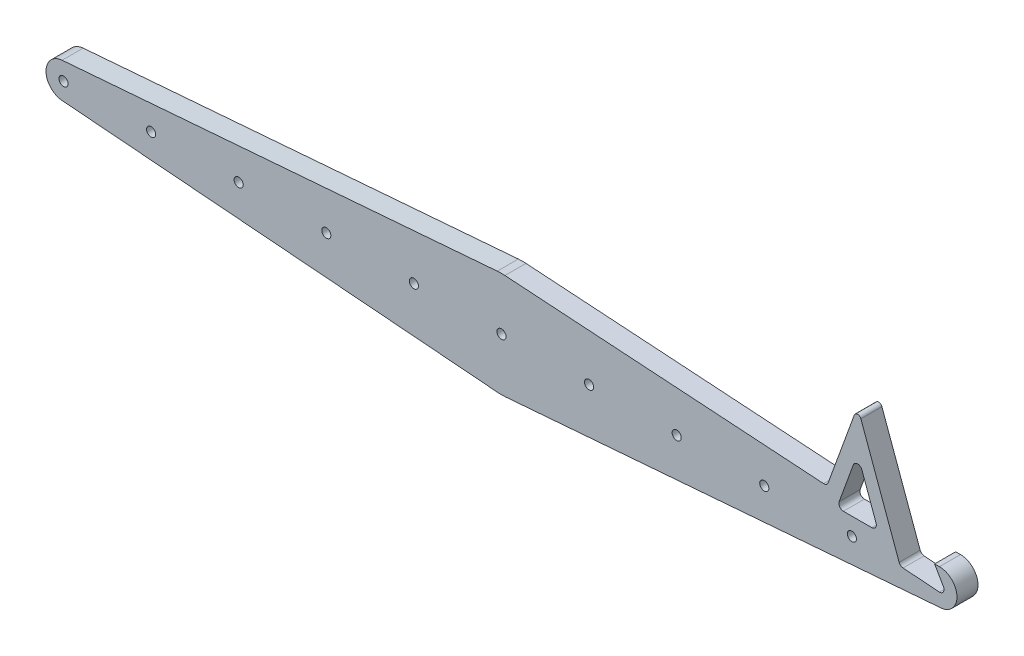
ISO-10303-21;
HEADER;
FILE_DESCRIPTION(('STEP AP214'),'2;1');
FILE_NAME('part.step','',(''),(''),'','','');
FILE_SCHEMA(('AUTOMOTIVE_DESIGN { 1 0 10303 214 1 1 1 1 }'));
ENDSEC;
DATA;
#1=APPLICATION_CONTEXT('core data for automotive mechanical design processes');
#2=APPLICATION_PROTOCOL_DEFINITION('international standard','automotive_design',2000,#1);
#3=PRODUCT_CONTEXT('',#1,'mechanical');
#4=PRODUCT('Part','Part','',(#3));
#5=PRODUCT_RELATED_PRODUCT_CATEGORY('part','',(#4));
#6=PRODUCT_DEFINITION_FORMATION('','',#4);
#7=PRODUCT_DEFINITION_CONTEXT('part definition',#1,'design');
#8=PRODUCT_DEFINITION('design','',#6,#7);
#9=PRODUCT_DEFINITION_SHAPE('','',#8);
#10=(LENGTH_UNIT() NAMED_UNIT(*) SI_UNIT(.MILLI.,.METRE.));
#11=(NAMED_UNIT(*) PLANE_ANGLE_UNIT() SI_UNIT($,.RADIAN.));
#12=(NAMED_UNIT(*) SI_UNIT($,.STERADIAN.) SOLID_ANGLE_UNIT());
#13=UNCERTAINTY_MEASURE_WITH_UNIT(LENGTH_MEASURE(1.E-05),#10,'distance_accuracy_value','');
#14=(GEOMETRIC_REPRESENTATION_CONTEXT(3) GLOBAL_UNCERTAINTY_ASSIGNED_CONTEXT((#13)) GLOBAL_UNIT_ASSIGNED_CONTEXT((#10,
#11,#12)) REPRESENTATION_CONTEXT('',''));
#15=CARTESIAN_POINT('',(0.,0.,0.));
#16=DIRECTION('',(0.,0.,1.));
#17=DIRECTION('',(1.,0.,0.));
#18=AXIS2_PLACEMENT_3D('',#15,#16,#17);
#19=CARTESIAN_POINT('',(0.,0.,6.));
#20=DIRECTION('',(0.,0.,-1.));
#21=DIRECTION('',(-1.,0.,0.));
#22=AXIS2_PLACEMENT_3D('',#19,#20,#21);
#23=CYLINDRICAL_SURFACE('',#22,5.);
#24=CARTESIAN_POINT('',(0.,0.,6.));
#25=DIRECTION('',(0.,0.,1.));
#26=DIRECTION('',(1.,0.,0.));
#27=AXIS2_PLACEMENT_3D('',#24,#25,#26);
#28=CIRCLE('',#27,5.);
#29=CARTESIAN_POINT('',(-0.400000000000001,4.98397431775085,6.));
#30=VERTEX_POINT('',#29);
#31=CARTESIAN_POINT('',(-0.4,-4.98397431775085,6.));
#32=VERTEX_POINT('',#31);
#33=EDGE_CURVE('E55',#30,#32,#28,.T.);
#34=ORIENTED_EDGE('',*,*,#33,.F.);
#35=DIRECTION('',(0.,0.,1.));
#36=VECTOR('',#35,1.);
#37=CARTESIAN_POINT('',(-0.400000000000001,4.98397431775085,0.));
#38=LINE('',#37,#36);
#39=CARTESIAN_POINT('',(-0.400000000000001,4.98397431775085,0.));
#40=VERTEX_POINT('',#39);
#41=EDGE_CURVE('E370',#40,#30,#38,.T.);
#42=ORIENTED_EDGE('',*,*,#41,.F.);
#43=CARTESIAN_POINT('',(0.,0.,0.));
#44=DIRECTION('',(0.,0.,1.));
#45=DIRECTION('',(1.,0.,0.));
#46=AXIS2_PLACEMENT_3D('',#43,#44,#45);
#47=CIRCLE('',#46,5.);
#48=CARTESIAN_POINT('',(-0.4,-4.98397431775085,0.));
#49=VERTEX_POINT('',#48);
#50=EDGE_CURVE('E351',#40,#49,#47,.T.);
#51=ORIENTED_EDGE('',*,*,#50,.T.);
#52=DIRECTION('',(0.,0.,1.));
#53=VECTOR('',#52,1.);
#54=CARTESIAN_POINT('',(-0.4,-4.98397431775085,0.));
#55=LINE('',#54,#53);
#56=EDGE_CURVE('E369',#49,#32,#55,.T.);
#57=ORIENTED_EDGE('',*,*,#56,.T.);
#58=EDGE_LOOP('',(#34,#42,#51,#57));
#59=FACE_BOUND('',#58,.T.);
#60=ADVANCED_FACE('F46',(#59),#23,.T.);
#61=CARTESIAN_POINT('',(0.,0.,6.));
#62=DIRECTION('',(0.,0.,1.));
#63=DIRECTION('',(1.,0.,0.));
#64=AXIS2_PLACEMENT_3D('',#61,#62,#63);
#65=PLANE('',#64);
#66=DIRECTION('',(-0.996794863550169,-0.0800000000000003,0.));
#67=VECTOR('',#66,1.);
#68=CARTESIAN_POINT('',(-0.400000000000001,4.98397431775084,6.));
#69=LINE('',#68,#67);
#70=CARTESIAN_POINT('',(123.8,14.9519229532526,6.));
#71=VERTEX_POINT('',#70);
#72=EDGE_CURVE('E554',#71,#30,#69,.T.);
#73=ORIENTED_EDGE('',*,*,#72,.T.);
#74=ORIENTED_EDGE('',*,*,#33,.T.);
#75=DIRECTION('',(-0.996794863550169,0.08,0.));
#76=VECTOR('',#75,1.);
#77=CARTESIAN_POINT('',(-0.4,-4.98397431775085,6.));
#78=LINE('',#77,#76);
#79=CARTESIAN_POINT('',(123.8,-14.9519229532525,6.));
#80=VERTEX_POINT('',#79);
#81=EDGE_CURVE('E384',#80,#32,#78,.T.);
#82=ORIENTED_EDGE('',*,*,#81,.F.);
#83=CARTESIAN_POINT('',(125.,0.,6.));
#84=DIRECTION('',(0.,0.,1.));
#85=DIRECTION('',(1.,0.,0.));
#86=AXIS2_PLACEMENT_3D('',#83,#84,#85);
#87=CIRCLE('',#86,15.);
#88=CARTESIAN_POINT('',(126.2,-14.9519229532526,6.));
#89=VERTEX_POINT('',#88);
#90=EDGE_CURVE('E513',#80,#89,#87,.T.);
#91=ORIENTED_EDGE('',*,*,#90,.T.);
#92=DIRECTION('',(-0.996794863550169,-0.0800000000000002,0.));
#93=VECTOR('',#92,1.);
#94=CARTESIAN_POINT('',(2.00000000000001,-24.9198715887543,6.));
#95=LINE('',#94,#93);
#96=CARTESIAN_POINT('',(250.4,-4.98397431775084,6.));
#97=VERTEX_POINT('',#96);
#98=EDGE_CURVE('E379',#97,#89,#95,.T.);
#99=ORIENTED_EDGE('',*,*,#98,.F.);
#100=CARTESIAN_POINT('',(250.,0.,6.));
#101=DIRECTION('',(0.,0.,1.));
#102=DIRECTION('',(1.,0.,0.));
#103=AXIS2_PLACEMENT_3D('',#100,#101,#102);
#104=CIRCLE('',#103,4.99999999999999);
#105=CARTESIAN_POINT('',(250.,5.,6.));
#106=VERTEX_POINT('',#105);
#107=EDGE_CURVE('E347',#97,#106,#104,.T.);
#108=ORIENTED_EDGE('',*,*,#107,.T.);
#109=DIRECTION('',(1.,0.,0.));
#110=VECTOR('',#109,1.);
#111=CARTESIAN_POINT('',(0.,5.,6.));
#112=LINE('',#111,#110);
#113=CARTESIAN_POINT('',(248.614359353945,5.,6.));
#114=VERTEX_POINT('',#113);
#115=EDGE_CURVE('E350',#114,#106,#112,.T.);
#116=ORIENTED_EDGE('',*,*,#115,.F.);
#117=DIRECTION('',(-0.499999999999997,0.86602540378444,0.));
#118=VECTOR('',#117,1.);
#119=CARTESIAN_POINT('',(188.62583302492,108.903175473054,6.));
#120=LINE('',#119,#118);
#121=CARTESIAN_POINT('',(251.12583302492,0.650000000000026,6.));
#122=VERTEX_POINT('',#121);
#123=EDGE_CURVE('E233',#122,#114,#120,.T.);
#124=ORIENTED_EDGE('',*,*,#123,.F.);
#125=CARTESIAN_POINT('',(250.,0.,6.));
#126=DIRECTION('',(0.,0.,1.));
#127=DIRECTION('',(1.,0.,0.));
#128=AXIS2_PLACEMENT_3D('',#125,#126,#127);
#129=CIRCLE('',#128,1.30000000000004);
#130=CARTESIAN_POINT('',(250.,-1.30000000000004,6.));
#131=VERTEX_POINT('',#130);
#132=EDGE_CURVE('E263',#131,#122,#129,.T.);
#133=ORIENTED_EDGE('',*,*,#132,.F.);
#134=DIRECTION('',(-0.997107424020356,0.0760051640580496,0.));
#135=VECTOR('',#134,1.);
#136=CARTESIAN_POINT('',(1.34567533352274,17.6538381569941,6.));
#137=LINE('',#136,#135);
#138=CARTESIAN_POINT('',(239.614425939517,-0.50835284013703,6.));
#139=VERTEX_POINT('',#138);
#140=EDGE_CURVE('E214',#131,#139,#137,.T.);
#141=ORIENTED_EDGE('',*,*,#140,.T.);
#142=CARTESIAN_POINT('',(239.713232652792,0.787886811089431,6.));
#143=DIRECTION('',(0.,0.,1.));
#144=DIRECTION('',(1.,0.,0.));
#145=AXIS2_PLACEMENT_3D('',#142,#143,#144);
#146=CIRCLE('',#145,1.3);
#147=CARTESIAN_POINT('',(238.491632245771,0.343260624766084,6.));
#148=VERTEX_POINT('',#147);
#149=EDGE_CURVE('E62',#148,#139,#146,.T.);
#150=ORIENTED_EDGE('',*,*,#149,.F.);
#151=DIRECTION('',(-0.342020143325672,0.939692620785907,0.));
#152=VECTOR('',#151,1.);
#153=CARTESIAN_POINT('',(210.703732767255,76.689886976062,6.));
#154=LINE('',#153,#152);
#155=CARTESIAN_POINT('',(227.572976716105,30.3420201433257,6.));
#156=VERTEX_POINT('',#155);
#157=EDGE_CURVE('E221',#148,#156,#154,.T.);
#158=ORIENTED_EDGE('',*,*,#157,.T.);
#159=CARTESIAN_POINT('',(226.633284095319,30.,6.));
#160=DIRECTION('',(0.,0.,1.));
#161=DIRECTION('',(1.,0.,0.));
#162=AXIS2_PLACEMENT_3D('',#159,#160,#161);
#163=CIRCLE('',#162,1.00000000000001);
#164=CARTESIAN_POINT('',(225.693591474533,30.3420201433257,6.));
#165=VERTEX_POINT('',#164);
#166=EDGE_CURVE('E450',#156,#165,#163,.T.);
#167=ORIENTED_EDGE('',*,*,#166,.T.);
#168=DIRECTION('',(-0.342020143325673,-0.939692620785907,0.));
#169=VECTOR('',#168,1.);
#170=CARTESIAN_POINT('',(189.540719235087,-68.98717998298,6.));
#171=LINE('',#170,#169);
#172=CARTESIAN_POINT('',(218.236046624375,9.85258406294588,6.));
#173=VERTEX_POINT('',#172);
#174=EDGE_CURVE('E468',#165,#173,#171,.T.);
#175=ORIENTED_EDGE('',*,*,#174,.T.);
#176=CARTESIAN_POINT('',(217.014446217353,10.2972102492692,6.));
#177=DIRECTION('',(0.,0.,1.));
#178=DIRECTION('',(1.,0.,0.));
#179=AXIS2_PLACEMENT_3D('',#176,#177,#178);
#180=CIRCLE('',#179,1.29999999999999);
#181=CARTESIAN_POINT('',(216.929325308107,9.00000000000001,6.));
#182=VERTEX_POINT('',#181);
#183=EDGE_CURVE('E488',#173,#182,#180,.F.);
#184=ORIENTED_EDGE('',*,*,#183,.T.);
#185=DIRECTION('',(0.997854037899418,-0.0654776224967506,0.));
#186=VECTOR('',#185,1.);
#187=CARTESIAN_POINT('',(1.51807921842963,23.1349493185458,6.));
#188=LINE('',#187,#186);
#189=CARTESIAN_POINT('',(125.982164337451,14.9678105684913,6.));
#190=VERTEX_POINT('',#189);
#191=EDGE_CURVE('E562',#190,#182,#188,.T.);
#192=ORIENTED_EDGE('',*,*,#191,.F.);
#193=CARTESIAN_POINT('',(125.,0.,6.));
#194=DIRECTION('',(0.,0.,1.));
#195=DIRECTION('',(1.,0.,0.));
#196=AXIS2_PLACEMENT_3D('',#193,#194,#195);
#197=CIRCLE('',#196,15.);
#198=EDGE_CURVE('E566',#190,#71,#197,.T.);
#199=ORIENTED_EDGE('',*,*,#198,.T.);
#200=EDGE_LOOP('',(#73,#74,#82,#91,#99,#108,#116,#124,#133,#141,#150,#158,#167,#175,#184,#192,#199));
#201=FACE_BOUND('',#200,.T.);
#202=CARTESIAN_POINT('',(230.683414225782,6.3,6.));
#203=DIRECTION('',(0.,0.,1.));
#204=DIRECTION('',(1.,0.,0.));
#205=AXIS2_PLACEMENT_3D('',#202,#203,#204);
#206=CIRCLE('',#205,1.3);
#207=CARTESIAN_POINT('',(230.683414225782,5.,6.));
#208=VERTEX_POINT('',#207);
#209=CARTESIAN_POINT('',(231.905014632803,6.74462618632338,6.));
#210=VERTEX_POINT('',#209);
#211=EDGE_CURVE('E70',#208,#210,#206,.T.);
#212=ORIENTED_EDGE('',*,*,#211,.F.);
#213=DIRECTION('',(1.,0.,0.));
#214=VECTOR('',#213,1.);
#215=CARTESIAN_POINT('',(222.583153964856,5.,6.));
#216=LINE('',#215,#214);
#217=CARTESIAN_POINT('',(222.583153964856,5.,6.));
#218=VERTEX_POINT('',#217);
#219=EDGE_CURVE('E408',#218,#208,#216,.T.);
#220=ORIENTED_EDGE('',*,*,#219,.F.);
#221=CARTESIAN_POINT('',(222.583153964856,6.3,6.));
#222=DIRECTION('',(0.,0.,1.));
#223=DIRECTION('',(1.,0.,0.));
#224=AXIS2_PLACEMENT_3D('',#221,#222,#223);
#225=CIRCLE('',#224,1.3);
#226=CARTESIAN_POINT('',(221.361553557835,6.74462618632338,6.));
#227=VERTEX_POINT('',#226);
#228=EDGE_CURVE('E440',#227,#218,#225,.T.);
#229=ORIENTED_EDGE('',*,*,#228,.F.);
#230=DIRECTION('',(-0.342020143325673,-0.939692620785907,0.));
#231=VECTOR('',#230,1.);
#232=CARTESIAN_POINT('',(225.411683688297,17.8722672656223,6.));
#233=LINE('',#232,#231);
#234=CARTESIAN_POINT('',(225.411683688297,17.8722672656223,6.));
#235=VERTEX_POINT('',#234);
#236=EDGE_CURVE('E436',#235,#227,#233,.T.);
#237=ORIENTED_EDGE('',*,*,#236,.F.);
#238=CARTESIAN_POINT('',(226.633284095319,17.427641079299,6.));
#239=DIRECTION('',(0.,0.,1.));
#240=DIRECTION('',(1.,0.,0.));
#241=AXIS2_PLACEMENT_3D('',#238,#239,#240);
#242=CIRCLE('',#241,1.30000000000001);
#243=CARTESIAN_POINT('',(227.854884502341,17.8722672656223,6.));
#244=VERTEX_POINT('',#243);
#245=EDGE_CURVE('E432',#244,#235,#242,.T.);
#246=ORIENTED_EDGE('',*,*,#245,.F.);
#247=DIRECTION('',(-0.342020143325671,0.939692620785907,0.));
#248=VECTOR('',#247,1.);
#249=CARTESIAN_POINT('',(231.905014632804,6.74462618632338,6.));
#250=LINE('',#249,#248);
#251=EDGE_CURVE('E390',#210,#244,#250,.T.);
#252=ORIENTED_EDGE('',*,*,#251,.F.);
#253=EDGE_LOOP('',(#212,#220,#229,#237,#246,#252));
#254=FACE_BOUND('',#253,.T.);
#255=CARTESIAN_POINT('',(0.,0.,6.));
#256=DIRECTION('',(0.,0.,1.));
#257=DIRECTION('',(1.,0.,0.));
#258=AXIS2_PLACEMENT_3D('',#255,#256,#257);
#259=CIRCLE('',#258,1.3);
#260=CARTESIAN_POINT('',(1.3,0.,6.));
#261=VERTEX_POINT('',#260);
#262=EDGE_CURVE('E336',#261,#261,#259,.T.);
#263=ORIENTED_EDGE('',*,*,#262,.F.);
#264=EDGE_LOOP('',(#263));
#265=FACE_BOUND('',#264,.T.);
#266=CARTESIAN_POINT('',(100.,0.,6.));
#267=DIRECTION('',(0.,0.,1.));
#268=DIRECTION('',(1.,0.,0.));
#269=AXIS2_PLACEMENT_3D('',#266,#267,#268);
#270=CIRCLE('',#269,1.3);
#271=CARTESIAN_POINT('',(101.3,0.,6.));
#272=VERTEX_POINT('',#271);
#273=EDGE_CURVE('E305',#272,#272,#270,.T.);
#274=ORIENTED_EDGE('',*,*,#273,.F.);
#275=EDGE_LOOP('',(#274));
#276=FACE_BOUND('',#275,.T.);
#277=CARTESIAN_POINT('',(125.,0.,6.));
#278=DIRECTION('',(0.,0.,1.));
#279=DIRECTION('',(1.,0.,0.));
#280=AXIS2_PLACEMENT_3D('',#277,#278,#279);
#281=CIRCLE('',#280,1.3);
#282=CARTESIAN_POINT('',(126.3,0.,6.));
#283=VERTEX_POINT('',#282);
#284=EDGE_CURVE('E297',#283,#283,#281,.T.);
#285=ORIENTED_EDGE('',*,*,#284,.F.);
#286=EDGE_LOOP('',(#285));
#287=FACE_BOUND('',#286,.T.);
#288=CARTESIAN_POINT('',(50.,0.,6.));
#289=DIRECTION('',(0.,0.,1.));
#290=DIRECTION('',(1.,0.,0.));
#291=AXIS2_PLACEMENT_3D('',#288,#289,#290);
#292=CIRCLE('',#291,1.3);
#293=CARTESIAN_POINT('',(51.3,0.,6.));
#294=VERTEX_POINT('',#293);
#295=EDGE_CURVE('E321',#294,#294,#292,.T.);
#296=ORIENTED_EDGE('',*,*,#295,.F.);
#297=EDGE_LOOP('',(#296));
#298=FACE_BOUND('',#297,.T.);
#299=CARTESIAN_POINT('',(75.,0.,6.));
#300=DIRECTION('',(0.,0.,1.));
#301=DIRECTION('',(1.,0.,0.));
#302=AXIS2_PLACEMENT_3D('',#299,#300,#301);
#303=CIRCLE('',#302,1.3);
#304=CARTESIAN_POINT('',(76.3,0.,6.));
#305=VERTEX_POINT('',#304);
#306=EDGE_CURVE('E313',#305,#305,#303,.T.);
#307=ORIENTED_EDGE('',*,*,#306,.F.);
#308=EDGE_LOOP('',(#307));
#309=FACE_BOUND('',#308,.T.);
#310=CARTESIAN_POINT('',(200.,0.,6.));
#311=DIRECTION('',(0.,0.,1.));
#312=DIRECTION('',(1.,0.,0.));
#313=AXIS2_PLACEMENT_3D('',#310,#311,#312);
#314=CIRCLE('',#313,1.3);
#315=CARTESIAN_POINT('',(201.3,0.,6.));
#316=VERTEX_POINT('',#315);
#317=EDGE_CURVE('E273',#316,#316,#314,.T.);
#318=ORIENTED_EDGE('',*,*,#317,.F.);
#319=EDGE_LOOP('',(#318));
#320=FACE_BOUND('',#319,.T.);
#321=CARTESIAN_POINT('',(225.,0.,6.));
#322=DIRECTION('',(0.,0.,1.));
#323=DIRECTION('',(1.,0.,0.));
#324=AXIS2_PLACEMENT_3D('',#321,#322,#323);
#325=CIRCLE('',#324,1.3);
#326=CARTESIAN_POINT('',(226.3,0.,6.));
#327=VERTEX_POINT('',#326);
#328=EDGE_CURVE('E252',#327,#327,#325,.T.);
#329=ORIENTED_EDGE('',*,*,#328,.F.);
#330=EDGE_LOOP('',(#329));
#331=FACE_BOUND('',#330,.T.);
#332=CARTESIAN_POINT('',(150.,0.,6.));
#333=DIRECTION('',(0.,0.,1.));
#334=DIRECTION('',(1.,0.,0.));
#335=AXIS2_PLACEMENT_3D('',#332,#333,#334);
#336=CIRCLE('',#335,1.3);
#337=CARTESIAN_POINT('',(151.3,0.,6.));
#338=VERTEX_POINT('',#337);
#339=EDGE_CURVE('E289',#338,#338,#336,.T.);
#340=ORIENTED_EDGE('',*,*,#339,.F.);
#341=EDGE_LOOP('',(#340));
#342=FACE_BOUND('',#341,.T.);
#343=CARTESIAN_POINT('',(175.,0.,6.));
#344=DIRECTION('',(0.,0.,1.));
#345=DIRECTION('',(1.,0.,0.));
#346=AXIS2_PLACEMENT_3D('',#343,#344,#345);
#347=CIRCLE('',#346,1.3);
#348=CARTESIAN_POINT('',(176.3,0.,6.));
#349=VERTEX_POINT('',#348);
#350=EDGE_CURVE('E281',#349,#349,#347,.T.);
#351=ORIENTED_EDGE('',*,*,#350,.F.);
#352=EDGE_LOOP('',(#351));
#353=FACE_BOUND('',#352,.T.);
#354=CARTESIAN_POINT('',(25.,0.,6.));
#355=DIRECTION('',(0.,0.,1.));
#356=DIRECTION('',(1.,0.,0.));
#357=AXIS2_PLACEMENT_3D('',#354,#355,#356);
#358=CIRCLE('',#357,1.3);
#359=CARTESIAN_POINT('',(26.3,0.,6.));
#360=VERTEX_POINT('',#359);
#361=EDGE_CURVE('E264',#360,#360,#358,.T.);
#362=ORIENTED_EDGE('',*,*,#361,.F.);
#363=EDGE_LOOP('',(#362));
#364=FACE_BOUND('',#363,.T.);
#365=ADVANCED_FACE('F484',(#201,#254,#265,#276,#287,#298,#309,#320,#331,#342,#353,#364),#65,.T.);
#366=CARTESIAN_POINT('',(0.,0.,0.));
#367=DIRECTION('',(0.,0.,1.));
#368=DIRECTION('',(1.,0.,0.));
#369=AXIS2_PLACEMENT_3D('',#366,#367,#368);
#370=PLANE('',#369);
#371=ORIENTED_EDGE('',*,*,#50,.F.);
#372=DIRECTION('',(-0.996794863550169,-0.0800000000000003,0.));
#373=VECTOR('',#372,1.);
#374=CARTESIAN_POINT('',(-0.400000000000001,4.98397431775084,0.));
#375=LINE('',#374,#373);
#376=CARTESIAN_POINT('',(123.8,14.9519229532526,0.));
#377=VERTEX_POINT('',#376);
#378=EDGE_CURVE('E498',#377,#40,#375,.T.);
#379=ORIENTED_EDGE('',*,*,#378,.F.);
#380=CARTESIAN_POINT('',(125.,0.,0.));
#381=DIRECTION('',(0.,0.,1.));
#382=DIRECTION('',(1.,0.,0.));
#383=AXIS2_PLACEMENT_3D('',#380,#381,#382);
#384=CIRCLE('',#383,15.);
#385=CARTESIAN_POINT('',(125.982164337451,14.9678105684913,0.));
#386=VERTEX_POINT('',#385);
#387=EDGE_CURVE('E504',#386,#377,#384,.T.);
#388=ORIENTED_EDGE('',*,*,#387,.F.);
#389=DIRECTION('',(0.997854037899418,-0.0654776224967506,0.));
#390=VECTOR('',#389,1.);
#391=CARTESIAN_POINT('',(1.51807921842963,23.1349493185458,0.));
#392=LINE('',#391,#390);
#393=CARTESIAN_POINT('',(216.929325308107,9.00000000000001,0.));
#394=VERTEX_POINT('',#393);
#395=EDGE_CURVE('E553',#386,#394,#392,.T.);
#396=ORIENTED_EDGE('',*,*,#395,.T.);
#397=CARTESIAN_POINT('',(217.014446217353,10.2972102492692,0.));
#398=DIRECTION('',(0.,0.,1.));
#399=DIRECTION('',(1.,0.,0.));
#400=AXIS2_PLACEMENT_3D('',#397,#398,#399);
#401=CIRCLE('',#400,1.29999999999999);
#402=CARTESIAN_POINT('',(218.236046624375,9.85258406294588,0.));
#403=VERTEX_POINT('',#402);
#404=EDGE_CURVE('E550',#403,#394,#401,.F.);
#405=ORIENTED_EDGE('',*,*,#404,.F.);
#406=DIRECTION('',(-0.342020143325673,-0.939692620785907,0.));
#407=VECTOR('',#406,1.);
#408=CARTESIAN_POINT('',(189.540719235087,-68.98717998298,0.));
#409=LINE('',#408,#407);
#410=CARTESIAN_POINT('',(225.693591474533,30.3420201433257,0.));
#411=VERTEX_POINT('',#410);
#412=EDGE_CURVE('E467',#411,#403,#409,.T.);
#413=ORIENTED_EDGE('',*,*,#412,.F.);
#414=CARTESIAN_POINT('',(226.633284095319,30.,0.));
#415=DIRECTION('',(0.,0.,1.));
#416=DIRECTION('',(1.,0.,0.));
#417=AXIS2_PLACEMENT_3D('',#414,#415,#416);
#418=CIRCLE('',#417,1.00000000000001);
#419=CARTESIAN_POINT('',(227.572976716105,30.3420201433257,0.));
#420=VERTEX_POINT('',#419);
#421=EDGE_CURVE('E230',#420,#411,#418,.T.);
#422=ORIENTED_EDGE('',*,*,#421,.F.);
#423=DIRECTION('',(-0.342020143325672,0.939692620785907,0.));
#424=VECTOR('',#423,1.);
#425=CARTESIAN_POINT('',(210.703732767255,76.689886976062,0.));
#426=LINE('',#425,#424);
#427=CARTESIAN_POINT('',(238.491632245771,0.343260624766084,0.));
#428=VERTEX_POINT('',#427);
#429=EDGE_CURVE('E219',#428,#420,#426,.T.);
#430=ORIENTED_EDGE('',*,*,#429,.F.);
#431=CARTESIAN_POINT('',(239.713232652792,0.787886811089431,0.));
#432=DIRECTION('',(0.,0.,1.));
#433=DIRECTION('',(1.,0.,0.));
#434=AXIS2_PLACEMENT_3D('',#431,#432,#433);
#435=CIRCLE('',#434,1.3);
#436=CARTESIAN_POINT('',(239.614425939517,-0.50835284013703,0.));
#437=VERTEX_POINT('',#436);
#438=EDGE_CURVE('E202',#428,#437,#435,.T.);
#439=ORIENTED_EDGE('',*,*,#438,.T.);
#440=DIRECTION('',(-0.997107424020356,0.0760051640580496,0.));
#441=VECTOR('',#440,1.);
#442=CARTESIAN_POINT('',(1.34567533352274,17.6538381569941,0.));
#443=LINE('',#442,#441);
#444=CARTESIAN_POINT('',(250.,-1.30000000000004,0.));
#445=VERTEX_POINT('',#444);
#446=EDGE_CURVE('E213',#445,#437,#443,.T.);
#447=ORIENTED_EDGE('',*,*,#446,.F.);
#448=CARTESIAN_POINT('',(250.,0.,0.));
#449=DIRECTION('',(0.,0.,1.));
#450=DIRECTION('',(1.,0.,0.));
#451=AXIS2_PLACEMENT_3D('',#448,#449,#450);
#452=CIRCLE('',#451,1.30000000000004);
#453=CARTESIAN_POINT('',(251.12583302492,0.650000000000019,0.));
#454=VERTEX_POINT('',#453);
#455=EDGE_CURVE('E340',#445,#454,#452,.T.);
#456=ORIENTED_EDGE('',*,*,#455,.T.);
#457=DIRECTION('',(-0.499999999999997,0.86602540378444,0.));
#458=VECTOR('',#457,1.);
#459=CARTESIAN_POINT('',(188.62583302492,108.903175473054,0.));
#460=LINE('',#459,#458);
#461=CARTESIAN_POINT('',(248.614359353945,5.,0.));
#462=VERTEX_POINT('',#461);
#463=EDGE_CURVE('E232',#454,#462,#460,.T.);
#464=ORIENTED_EDGE('',*,*,#463,.T.);
#465=DIRECTION('',(1.,0.,0.));
#466=VECTOR('',#465,1.);
#467=CARTESIAN_POINT('',(0.,5.,0.));
#468=LINE('',#467,#466);
#469=CARTESIAN_POINT('',(250.,5.,0.));
#470=VERTEX_POINT('',#469);
#471=EDGE_CURVE('E359',#462,#470,#468,.T.);
#472=ORIENTED_EDGE('',*,*,#471,.T.);
#473=CARTESIAN_POINT('',(250.,0.,0.));
#474=DIRECTION('',(0.,0.,1.));
#475=DIRECTION('',(1.,0.,0.));
#476=AXIS2_PLACEMENT_3D('',#473,#474,#475);
#477=CIRCLE('',#476,4.99999999999999);
#478=CARTESIAN_POINT('',(250.4,-4.98397431775084,0.));
#479=VERTEX_POINT('',#478);
#480=EDGE_CURVE('E335',#479,#470,#477,.T.);
#481=ORIENTED_EDGE('',*,*,#480,.F.);
#482=DIRECTION('',(-0.996794863550169,-0.0800000000000002,0.));
#483=VECTOR('',#482,1.);
#484=CARTESIAN_POINT('',(2.00000000000001,-24.9198715887543,0.));
#485=LINE('',#484,#483);
#486=CARTESIAN_POINT('',(126.2,-14.9519229532526,0.));
#487=VERTEX_POINT('',#486);
#488=EDGE_CURVE('E402',#479,#487,#485,.T.);
#489=ORIENTED_EDGE('',*,*,#488,.T.);
#490=CARTESIAN_POINT('',(125.,0.,0.));
#491=DIRECTION('',(0.,0.,1.));
#492=DIRECTION('',(1.,0.,0.));
#493=AXIS2_PLACEMENT_3D('',#490,#491,#492);
#494=CIRCLE('',#493,15.);
#495=CARTESIAN_POINT('',(123.8,-14.9519229532525,0.));
#496=VERTEX_POINT('',#495);
#497=EDGE_CURVE('E376',#496,#487,#494,.T.);
#498=ORIENTED_EDGE('',*,*,#497,.F.);
#499=DIRECTION('',(-0.996794863550169,0.08,0.));
#500=VECTOR('',#499,1.);
#501=CARTESIAN_POINT('',(-0.4,-4.98397431775085,0.));
#502=LINE('',#501,#500);
#503=EDGE_CURVE('E374',#496,#49,#502,.T.);
#504=ORIENTED_EDGE('',*,*,#503,.T.);
#505=EDGE_LOOP('',(#371,#379,#388,#396,#405,#413,#422,#430,#439,#447,#456,#464,#472,#481,#489,
#498,#504));
#506=FACE_BOUND('',#505,.T.);
#507=DIRECTION('',(1.,0.,0.));
#508=VECTOR('',#507,1.);
#509=CARTESIAN_POINT('',(222.583153964856,5.,0.));
#510=LINE('',#509,#508);
#511=CARTESIAN_POINT('',(222.583153964856,5.,0.));
#512=VERTEX_POINT('',#511);
#513=CARTESIAN_POINT('',(230.683414225782,5.,0.));
#514=VERTEX_POINT('',#513);
#515=EDGE_CURVE('E424',#512,#514,#510,.T.);
#516=ORIENTED_EDGE('',*,*,#515,.T.);
#517=CARTESIAN_POINT('',(230.683414225782,6.3,0.));
#518=DIRECTION('',(0.,0.,1.));
#519=DIRECTION('',(1.,0.,0.));
#520=AXIS2_PLACEMENT_3D('',#517,#518,#519);
#521=CIRCLE('',#520,1.3);
#522=CARTESIAN_POINT('',(231.905014632804,6.74462618632338,0.));
#523=VERTEX_POINT('',#522);
#524=EDGE_CURVE('E403',#514,#523,#521,.T.);
#525=ORIENTED_EDGE('',*,*,#524,.T.);
#526=DIRECTION('',(-0.342020143325671,0.939692620785907,0.));
#527=VECTOR('',#526,1.);
#528=CARTESIAN_POINT('',(231.905014632804,6.74462618632338,0.));
#529=LINE('',#528,#527);
#530=CARTESIAN_POINT('',(227.854884502341,17.8722672656223,0.));
#531=VERTEX_POINT('',#530);
#532=EDGE_CURVE('E407',#523,#531,#529,.T.);
#533=ORIENTED_EDGE('',*,*,#532,.T.);
#534=CARTESIAN_POINT('',(226.633284095319,17.427641079299,0.));
#535=DIRECTION('',(0.,0.,1.));
#536=DIRECTION('',(1.,0.,0.));
#537=AXIS2_PLACEMENT_3D('',#534,#535,#536);
#538=CIRCLE('',#537,1.30000000000001);
#539=CARTESIAN_POINT('',(225.411683688297,17.8722672656223,0.));
#540=VERTEX_POINT('',#539);
#541=EDGE_CURVE('E412',#531,#540,#538,.T.);
#542=ORIENTED_EDGE('',*,*,#541,.T.);
#543=DIRECTION('',(-0.342020143325673,-0.939692620785907,0.));
#544=VECTOR('',#543,1.);
#545=CARTESIAN_POINT('',(225.411683688297,17.8722672656223,0.));
#546=LINE('',#545,#544);
#547=CARTESIAN_POINT('',(221.361553557835,6.74462618632338,0.));
#548=VERTEX_POINT('',#547);
#549=EDGE_CURVE('E416',#540,#548,#546,.T.);
#550=ORIENTED_EDGE('',*,*,#549,.T.);
#551=CARTESIAN_POINT('',(222.583153964856,6.3,0.));
#552=DIRECTION('',(0.,0.,1.));
#553=DIRECTION('',(1.,0.,0.));
#554=AXIS2_PLACEMENT_3D('',#551,#552,#553);
#555=CIRCLE('',#554,1.3);
#556=EDGE_CURVE('E420',#548,#512,#555,.T.);
#557=ORIENTED_EDGE('',*,*,#556,.T.);
#558=EDGE_LOOP('',(#516,#525,#533,#542,#550,#557));
#559=FACE_BOUND('',#558,.T.);
#560=CARTESIAN_POINT('',(25.,0.,0.));
#561=DIRECTION('',(0.,0.,1.));
#562=DIRECTION('',(1.,0.,0.));
#563=AXIS2_PLACEMENT_3D('',#560,#561,#562);
#564=CIRCLE('',#563,1.3);
#565=CARTESIAN_POINT('',(26.3,0.,0.));
#566=VERTEX_POINT('',#565);
#567=EDGE_CURVE('E259',#566,#566,#564,.T.);
#568=ORIENTED_EDGE('',*,*,#567,.T.);
#569=EDGE_LOOP('',(#568));
#570=FACE_BOUND('',#569,.T.);
#571=CARTESIAN_POINT('',(175.,0.,0.));
#572=DIRECTION('',(0.,0.,1.));
#573=DIRECTION('',(1.,0.,0.));
#574=AXIS2_PLACEMENT_3D('',#571,#572,#573);
#575=CIRCLE('',#574,1.3);
#576=CARTESIAN_POINT('',(176.3,0.,0.));
#577=VERTEX_POINT('',#576);
#578=EDGE_CURVE('E285',#577,#577,#575,.T.);
#579=ORIENTED_EDGE('',*,*,#578,.T.);
#580=EDGE_LOOP('',(#579));
#581=FACE_BOUND('',#580,.T.);
#582=CARTESIAN_POINT('',(150.,0.,0.));
#583=DIRECTION('',(0.,0.,1.));
#584=DIRECTION('',(1.,0.,0.));
#585=AXIS2_PLACEMENT_3D('',#582,#583,#584);
#586=CIRCLE('',#585,1.3);
#587=CARTESIAN_POINT('',(151.3,0.,0.));
#588=VERTEX_POINT('',#587);
#589=EDGE_CURVE('E293',#588,#588,#586,.T.);
#590=ORIENTED_EDGE('',*,*,#589,.T.);
#591=EDGE_LOOP('',(#590));
#592=FACE_BOUND('',#591,.T.);
#593=CARTESIAN_POINT('',(225.,0.,0.));
#594=DIRECTION('',(0.,0.,1.));
#595=DIRECTION('',(1.,0.,0.));
#596=AXIS2_PLACEMENT_3D('',#593,#594,#595);
#597=CIRCLE('',#596,1.3);
#598=CARTESIAN_POINT('',(226.3,0.,0.));
#599=VERTEX_POINT('',#598);
#600=EDGE_CURVE('E269',#599,#599,#597,.T.);
#601=ORIENTED_EDGE('',*,*,#600,.T.);
#602=EDGE_LOOP('',(#601));
#603=FACE_BOUND('',#602,.T.);
#604=CARTESIAN_POINT('',(200.,0.,0.));
#605=DIRECTION('',(0.,0.,1.));
#606=DIRECTION('',(1.,0.,0.));
#607=AXIS2_PLACEMENT_3D('',#604,#605,#606);
#608=CIRCLE('',#607,1.3);
#609=CARTESIAN_POINT('',(201.3,0.,0.));
#610=VERTEX_POINT('',#609);
#611=EDGE_CURVE('E277',#610,#610,#608,.T.);
#612=ORIENTED_EDGE('',*,*,#611,.T.);
#613=EDGE_LOOP('',(#612));
#614=FACE_BOUND('',#613,.T.);
#615=CARTESIAN_POINT('',(75.,0.,0.));
#616=DIRECTION('',(0.,0.,1.));
#617=DIRECTION('',(1.,0.,0.));
#618=AXIS2_PLACEMENT_3D('',#615,#616,#617);
#619=CIRCLE('',#618,1.3);
#620=CARTESIAN_POINT('',(76.3,0.,0.));
#621=VERTEX_POINT('',#620);
#622=EDGE_CURVE('E317',#621,#621,#619,.T.);
#623=ORIENTED_EDGE('',*,*,#622,.T.);
#624=EDGE_LOOP('',(#623));
#625=FACE_BOUND('',#624,.T.);
#626=CARTESIAN_POINT('',(50.,0.,0.));
#627=DIRECTION('',(0.,0.,1.));
#628=DIRECTION('',(1.,0.,0.));
#629=AXIS2_PLACEMENT_3D('',#626,#627,#628);
#630=CIRCLE('',#629,1.3);
#631=CARTESIAN_POINT('',(51.3,0.,0.));
#632=VERTEX_POINT('',#631);
#633=EDGE_CURVE('E268',#632,#632,#630,.T.);
#634=ORIENTED_EDGE('',*,*,#633,.T.);
#635=EDGE_LOOP('',(#634));
#636=FACE_BOUND('',#635,.T.);
#637=CARTESIAN_POINT('',(125.,0.,0.));
#638=DIRECTION('',(0.,0.,1.));
#639=DIRECTION('',(1.,0.,0.));
#640=AXIS2_PLACEMENT_3D('',#637,#638,#639);
#641=CIRCLE('',#640,1.3);
#642=CARTESIAN_POINT('',(126.3,0.,0.));
#643=VERTEX_POINT('',#642);
#644=EDGE_CURVE('E301',#643,#643,#641,.T.);
#645=ORIENTED_EDGE('',*,*,#644,.T.);
#646=EDGE_LOOP('',(#645));
#647=FACE_BOUND('',#646,.T.);
#648=CARTESIAN_POINT('',(100.,0.,0.));
#649=DIRECTION('',(0.,0.,1.));
#650=DIRECTION('',(1.,0.,0.));
#651=AXIS2_PLACEMENT_3D('',#648,#649,#650);
#652=CIRCLE('',#651,1.3);
#653=CARTESIAN_POINT('',(101.3,0.,0.));
#654=VERTEX_POINT('',#653);
#655=EDGE_CURVE('E309',#654,#654,#652,.T.);
#656=ORIENTED_EDGE('',*,*,#655,.T.);
#657=EDGE_LOOP('',(#656));
#658=FACE_BOUND('',#657,.T.);
#659=CARTESIAN_POINT('',(0.,0.,0.));
#660=DIRECTION('',(0.,0.,1.));
#661=DIRECTION('',(1.,0.,0.));
#662=AXIS2_PLACEMENT_3D('',#659,#660,#661);
#663=CIRCLE('',#662,1.3);
#664=CARTESIAN_POINT('',(1.3,0.,0.));
#665=VERTEX_POINT('',#664);
#666=EDGE_CURVE('E331',#665,#665,#663,.T.);
#667=ORIENTED_EDGE('',*,*,#666,.T.);
#668=EDGE_LOOP('',(#667));
#669=FACE_BOUND('',#668,.T.);
#670=ADVANCED_FACE('F226',(#506,#559,#570,#581,#592,#603,#614,#625,#636,#647,#658,#669),#370,.F.);
#671=CARTESIAN_POINT('',(250.,0.,6.));
#672=DIRECTION('',(0.,0.,-1.));
#673=DIRECTION('',(-1.,0.,0.));
#674=AXIS2_PLACEMENT_3D('',#671,#672,#673);
#675=CYLINDRICAL_SURFACE('',#674,4.99999999999999);
#676=ORIENTED_EDGE('',*,*,#107,.F.);
#677=DIRECTION('',(0.,0.,1.));
#678=VECTOR('',#677,1.);
#679=CARTESIAN_POINT('',(250.4,-4.98397431775084,0.));
#680=LINE('',#679,#678);
#681=EDGE_CURVE('E386',#479,#97,#680,.T.);
#682=ORIENTED_EDGE('',*,*,#681,.F.);
#683=ORIENTED_EDGE('',*,*,#480,.T.);
#684=DIRECTION('',(0.,0.,-1.));
#685=VECTOR('',#684,1.);
#686=CARTESIAN_POINT('',(250.,5.,6.));
#687=LINE('',#686,#685);
#688=EDGE_CURVE('E12',#106,#470,#687,.T.);
#689=ORIENTED_EDGE('',*,*,#688,.F.);
#690=EDGE_LOOP('',(#676,#682,#683,#689));
#691=FACE_BOUND('',#690,.T.);
#692=ADVANCED_FACE('F48',(#691),#675,.T.);
#693=CARTESIAN_POINT('',(0.,5.,6.));
#694=DIRECTION('',(0.,1.,0.));
#695=DIRECTION('',(-1.,0.,0.));
#696=AXIS2_PLACEMENT_3D('',#693,#694,#695);
#697=PLANE('',#696);
#698=DIRECTION('',(0.,0.,1.));
#699=VECTOR('',#698,1.);
#700=CARTESIAN_POINT('',(248.614359353945,5.,0.));
#701=LINE('',#700,#699);
#702=EDGE_CURVE('E248',#462,#114,#701,.T.);
#703=ORIENTED_EDGE('',*,*,#702,.T.);
#704=ORIENTED_EDGE('',*,*,#115,.T.);
#705=ORIENTED_EDGE('',*,*,#688,.T.);
#706=ORIENTED_EDGE('',*,*,#471,.F.);
#707=EDGE_LOOP('',(#703,#704,#705,#706));
#708=FACE_BOUND('',#707,.T.);
#709=ADVANCED_FACE('F531',(#708),#697,.T.);
#710=CARTESIAN_POINT('',(250.,0.,0.));
#711=DIRECTION('',(0.,0.,1.));
#712=DIRECTION('',(1.,0.,0.));
#713=AXIS2_PLACEMENT_3D('',#710,#711,#712);
#714=CYLINDRICAL_SURFACE('',#713,1.30000000000004);
#715=ORIENTED_EDGE('',*,*,#132,.T.);
#716=DIRECTION('',(0.,0.,1.));
#717=VECTOR('',#716,1.);
#718=CARTESIAN_POINT('',(251.12583302492,0.650000000000026,0.));
#719=LINE('',#718,#717);
#720=EDGE_CURVE('E253',#454,#122,#719,.T.);
#721=ORIENTED_EDGE('',*,*,#720,.F.);
#722=ORIENTED_EDGE('',*,*,#455,.F.);
#723=DIRECTION('',(0.,0.,1.));
#724=VECTOR('',#723,1.);
#725=CARTESIAN_POINT('',(250.,-1.30000000000004,0.));
#726=LINE('',#725,#724);
#727=EDGE_CURVE('E238',#445,#131,#726,.T.);
#728=ORIENTED_EDGE('',*,*,#727,.T.);
#729=EDGE_LOOP('',(#715,#721,#722,#728));
#730=FACE_BOUND('',#729,.T.);
#731=ADVANCED_FACE('F537',(#730),#714,.F.);
#732=CARTESIAN_POINT('',(0.,0.,0.));
#733=DIRECTION('',(0.,0.,1.));
#734=DIRECTION('',(1.,0.,0.));
#735=AXIS2_PLACEMENT_3D('',#732,#733,#734);
#736=CYLINDRICAL_SURFACE('',#735,1.3);
#737=ORIENTED_EDGE('',*,*,#666,.F.);
#738=EDGE_LOOP('',(#737));
#739=FACE_BOUND('',#738,.T.);
#740=ORIENTED_EDGE('',*,*,#262,.T.);
#741=EDGE_LOOP('',(#740));
#742=FACE_BOUND('',#741,.T.);
#743=ADVANCED_FACE('F611',(#739,#742),#736,.F.);
#744=CARTESIAN_POINT('',(100.,0.,0.));
#745=DIRECTION('',(0.,0.,1.));
#746=DIRECTION('',(1.,0.,0.));
#747=AXIS2_PLACEMENT_3D('',#744,#745,#746);
#748=CYLINDRICAL_SURFACE('',#747,1.3);
#749=ORIENTED_EDGE('',*,*,#655,.F.);
#750=EDGE_LOOP('',(#749));
#751=FACE_BOUND('',#750,.T.);
#752=ORIENTED_EDGE('',*,*,#273,.T.);
#753=EDGE_LOOP('',(#752));
#754=FACE_BOUND('',#753,.T.);
#755=ADVANCED_FACE('F798',(#751,#754),#748,.F.);
#756=CARTESIAN_POINT('',(125.,0.,0.));
#757=DIRECTION('',(0.,0.,1.));
#758=DIRECTION('',(1.,0.,0.));
#759=AXIS2_PLACEMENT_3D('',#756,#757,#758);
#760=CYLINDRICAL_SURFACE('',#759,1.3);
#761=ORIENTED_EDGE('',*,*,#644,.F.);
#762=EDGE_LOOP('',(#761));
#763=FACE_BOUND('',#762,.T.);
#764=ORIENTED_EDGE('',*,*,#284,.T.);
#765=EDGE_LOOP('',(#764));
#766=FACE_BOUND('',#765,.T.);
#767=ADVANCED_FACE('F788',(#763,#766),#760,.F.);
#768=CARTESIAN_POINT('',(50.,0.,0.));
#769=DIRECTION('',(0.,0.,1.));
#770=DIRECTION('',(1.,0.,0.));
#771=AXIS2_PLACEMENT_3D('',#768,#769,#770);
#772=CYLINDRICAL_SURFACE('',#771,1.3);
#773=ORIENTED_EDGE('',*,*,#633,.F.);
#774=EDGE_LOOP('',(#773));
#775=FACE_BOUND('',#774,.T.);
#776=ORIENTED_EDGE('',*,*,#295,.T.);
#777=EDGE_LOOP('',(#776));
#778=FACE_BOUND('',#777,.T.);
#779=ADVANCED_FACE('F778',(#775,#778),#772,.F.);
#780=CARTESIAN_POINT('',(75.,0.,0.));
#781=DIRECTION('',(0.,0.,1.));
#782=DIRECTION('',(1.,0.,0.));
#783=AXIS2_PLACEMENT_3D('',#780,#781,#782);
#784=CYLINDRICAL_SURFACE('',#783,1.3);
#785=ORIENTED_EDGE('',*,*,#622,.F.);
#786=EDGE_LOOP('',(#785));
#787=FACE_BOUND('',#786,.T.);
#788=ORIENTED_EDGE('',*,*,#306,.T.);
#789=EDGE_LOOP('',(#788));
#790=FACE_BOUND('',#789,.T.);
#791=ADVANCED_FACE('F768',(#787,#790),#784,.F.);
#792=CARTESIAN_POINT('',(200.,0.,0.));
#793=DIRECTION('',(0.,0.,1.));
#794=DIRECTION('',(1.,0.,0.));
#795=AXIS2_PLACEMENT_3D('',#792,#793,#794);
#796=CYLINDRICAL_SURFACE('',#795,1.3);
#797=ORIENTED_EDGE('',*,*,#611,.F.);
#798=EDGE_LOOP('',(#797));
#799=FACE_BOUND('',#798,.T.);
#800=ORIENTED_EDGE('',*,*,#317,.T.);
#801=EDGE_LOOP('',(#800));
#802=FACE_BOUND('',#801,.T.);
#803=ADVANCED_FACE('F758',(#799,#802),#796,.F.);
#804=CARTESIAN_POINT('',(225.,0.,0.));
#805=DIRECTION('',(0.,0.,1.));
#806=DIRECTION('',(1.,0.,0.));
#807=AXIS2_PLACEMENT_3D('',#804,#805,#806);
#808=CYLINDRICAL_SURFACE('',#807,1.3);
#809=ORIENTED_EDGE('',*,*,#600,.F.);
#810=EDGE_LOOP('',(#809));
#811=FACE_BOUND('',#810,.T.);
#812=ORIENTED_EDGE('',*,*,#328,.T.);
#813=EDGE_LOOP('',(#812));
#814=FACE_BOUND('',#813,.T.);
#815=ADVANCED_FACE('F748',(#811,#814),#808,.F.);
#816=CARTESIAN_POINT('',(150.,0.,0.));
#817=DIRECTION('',(0.,0.,1.));
#818=DIRECTION('',(1.,0.,0.));
#819=AXIS2_PLACEMENT_3D('',#816,#817,#818);
#820=CYLINDRICAL_SURFACE('',#819,1.3);
#821=ORIENTED_EDGE('',*,*,#589,.F.);
#822=EDGE_LOOP('',(#821));
#823=FACE_BOUND('',#822,.T.);
#824=ORIENTED_EDGE('',*,*,#339,.T.);
#825=EDGE_LOOP('',(#824));
#826=FACE_BOUND('',#825,.T.);
#827=ADVANCED_FACE('F738',(#823,#826),#820,.F.);
#828=CARTESIAN_POINT('',(175.,0.,0.));
#829=DIRECTION('',(0.,0.,1.));
#830=DIRECTION('',(1.,0.,0.));
#831=AXIS2_PLACEMENT_3D('',#828,#829,#830);
#832=CYLINDRICAL_SURFACE('',#831,1.3);
#833=ORIENTED_EDGE('',*,*,#578,.F.);
#834=EDGE_LOOP('',(#833));
#835=FACE_BOUND('',#834,.T.);
#836=ORIENTED_EDGE('',*,*,#350,.T.);
#837=EDGE_LOOP('',(#836));
#838=FACE_BOUND('',#837,.T.);
#839=ADVANCED_FACE('F727',(#835,#838),#832,.F.);
#840=CARTESIAN_POINT('',(25.,0.,0.));
#841=DIRECTION('',(0.,0.,1.));
#842=DIRECTION('',(1.,0.,0.));
#843=AXIS2_PLACEMENT_3D('',#840,#841,#842);
#844=CYLINDRICAL_SURFACE('',#843,1.3);
#845=ORIENTED_EDGE('',*,*,#567,.F.);
#846=EDGE_LOOP('',(#845));
#847=FACE_BOUND('',#846,.T.);
#848=ORIENTED_EDGE('',*,*,#361,.T.);
#849=EDGE_LOOP('',(#848));
#850=FACE_BOUND('',#849,.T.);
#851=ADVANCED_FACE('F722',(#847,#850),#844,.F.);
#852=CARTESIAN_POINT('',(210.703732767255,76.689886976062,0.));
#853=DIRECTION('',(0.939692620785907,0.342020143325672,0.));
#854=DIRECTION('',(-0.342020143325672,0.939692620785907,0.));
#855=AXIS2_PLACEMENT_3D('',#852,#853,#854);
#856=PLANE('',#855);
#857=DIRECTION('',(0.,0.,1.));
#858=VECTOR('',#857,1.);
#859=CARTESIAN_POINT('',(238.491632245771,0.343260624766084,0.));
#860=LINE('',#859,#858);
#861=EDGE_CURVE('E205',#428,#148,#860,.T.);
#862=ORIENTED_EDGE('',*,*,#861,.F.);
#863=ORIENTED_EDGE('',*,*,#429,.T.);
#864=DIRECTION('',(0.,0.,1.));
#865=VECTOR('',#864,1.);
#866=CARTESIAN_POINT('',(227.572976716105,30.3420201433257,0.));
#867=LINE('',#866,#865);
#868=EDGE_CURVE('E242',#420,#156,#867,.T.);
#869=ORIENTED_EDGE('',*,*,#868,.T.);
#870=ORIENTED_EDGE('',*,*,#157,.F.);
#871=EDGE_LOOP('',(#862,#863,#869,#870));
#872=FACE_BOUND('',#871,.T.);
#873=ADVANCED_FACE('F217',(#872),#856,.T.);
#874=CARTESIAN_POINT('',(188.62583302492,108.903175473054,0.));
#875=DIRECTION('',(0.86602540378444,0.499999999999997,0.));
#876=DIRECTION('',(-0.499999999999997,0.86602540378444,0.));
#877=AXIS2_PLACEMENT_3D('',#874,#875,#876);
#878=PLANE('',#877);
#879=ORIENTED_EDGE('',*,*,#123,.T.);
#880=ORIENTED_EDGE('',*,*,#702,.F.);
#881=ORIENTED_EDGE('',*,*,#463,.F.);
#882=ORIENTED_EDGE('',*,*,#720,.T.);
#883=EDGE_LOOP('',(#879,#880,#881,#882));
#884=FACE_BOUND('',#883,.T.);
#885=ADVANCED_FACE('F704',(#884),#878,.F.);
#886=CARTESIAN_POINT('',(189.540719235087,-68.98717998298,0.));
#887=DIRECTION('',(-0.939692620785907,0.342020143325673,0.));
#888=DIRECTION('',(-0.342020143325673,-0.939692620785907,0.));
#889=AXIS2_PLACEMENT_3D('',#886,#887,#888);
#890=PLANE('',#889);
#891=DIRECTION('',(0.,0.,1.));
#892=VECTOR('',#891,1.);
#893=CARTESIAN_POINT('',(218.236046624375,9.85258406294588,0.));
#894=LINE('',#893,#892);
#895=EDGE_CURVE('E492',#403,#173,#894,.T.);
#896=ORIENTED_EDGE('',*,*,#895,.T.);
#897=ORIENTED_EDGE('',*,*,#174,.F.);
#898=DIRECTION('',(0.,0.,1.));
#899=VECTOR('',#898,1.);
#900=CARTESIAN_POINT('',(225.693591474533,30.3420201433257,0.));
#901=LINE('',#900,#899);
#902=EDGE_CURVE('E246',#411,#165,#901,.T.);
#903=ORIENTED_EDGE('',*,*,#902,.F.);
#904=ORIENTED_EDGE('',*,*,#412,.T.);
#905=EDGE_LOOP('',(#896,#897,#903,#904));
#906=FACE_BOUND('',#905,.T.);
#907=ADVANCED_FACE('F491',(#906),#890,.T.);
#908=CARTESIAN_POINT('',(226.633284095319,30.,0.));
#909=DIRECTION('',(0.,0.,1.));
#910=DIRECTION('',(1.,0.,0.));
#911=AXIS2_PLACEMENT_3D('',#908,#909,#910);
#912=CYLINDRICAL_SURFACE('',#911,1.00000000000001);
#913=ORIENTED_EDGE('',*,*,#166,.F.);
#914=ORIENTED_EDGE('',*,*,#868,.F.);
#915=ORIENTED_EDGE('',*,*,#421,.T.);
#916=ORIENTED_EDGE('',*,*,#902,.T.);
#917=EDGE_LOOP('',(#913,#914,#915,#916));
#918=FACE_BOUND('',#917,.T.);
#919=ADVANCED_FACE('F482',(#918),#912,.T.);
#920=CARTESIAN_POINT('',(230.683414225782,6.3,0.));
#921=DIRECTION('',(0.,0.,1.));
#922=DIRECTION('',(1.,0.,0.));
#923=AXIS2_PLACEMENT_3D('',#920,#921,#922);
#924=CYLINDRICAL_SURFACE('',#923,1.3);
#925=ORIENTED_EDGE('',*,*,#211,.T.);
#926=DIRECTION('',(0.,0.,1.));
#927=VECTOR('',#926,1.);
#928=CARTESIAN_POINT('',(231.905014632804,6.74462618632338,0.));
#929=LINE('',#928,#927);
#930=EDGE_CURVE('E427',#523,#210,#929,.T.);
#931=ORIENTED_EDGE('',*,*,#930,.F.);
#932=ORIENTED_EDGE('',*,*,#524,.F.);
#933=DIRECTION('',(0.,0.,1.));
#934=VECTOR('',#933,1.);
#935=CARTESIAN_POINT('',(230.683414225782,5.,0.));
#936=LINE('',#935,#934);
#937=EDGE_CURVE('E447',#514,#208,#936,.T.);
#938=ORIENTED_EDGE('',*,*,#937,.T.);
#939=EDGE_LOOP('',(#925,#931,#932,#938));
#940=FACE_BOUND('',#939,.T.);
#941=ADVANCED_FACE('F680',(#940),#924,.F.);
#942=CARTESIAN_POINT('',(222.583153964856,5.,0.));
#943=DIRECTION('',(0.,-1.,0.));
#944=DIRECTION('',(0.,0.,-1.));
#945=AXIS2_PLACEMENT_3D('',#942,#943,#944);
#946=PLANE('',#945);
#947=ORIENTED_EDGE('',*,*,#219,.T.);
#948=ORIENTED_EDGE('',*,*,#937,.F.);
#949=ORIENTED_EDGE('',*,*,#515,.F.);
#950=DIRECTION('',(0.,0.,1.));
#951=VECTOR('',#950,1.);
#952=CARTESIAN_POINT('',(222.583153964856,5.,0.));
#953=LINE('',#952,#951);
#954=EDGE_CURVE('E451',#512,#218,#953,.T.);
#955=ORIENTED_EDGE('',*,*,#954,.T.);
#956=EDGE_LOOP('',(#947,#948,#949,#955));
#957=FACE_BOUND('',#956,.T.);
#958=ADVANCED_FACE('F670',(#957),#946,.F.);
#959=CARTESIAN_POINT('',(222.583153964856,6.3,0.));
#960=DIRECTION('',(0.,0.,1.));
#961=DIRECTION('',(1.,0.,0.));
#962=AXIS2_PLACEMENT_3D('',#959,#960,#961);
#963=CYLINDRICAL_SURFACE('',#962,1.3);
#964=ORIENTED_EDGE('',*,*,#228,.T.);
#965=ORIENTED_EDGE('',*,*,#954,.F.);
#966=ORIENTED_EDGE('',*,*,#556,.F.);
#967=DIRECTION('',(0.,0.,1.));
#968=VECTOR('',#967,1.);
#969=CARTESIAN_POINT('',(221.361553557835,6.74462618632338,0.));
#970=LINE('',#969,#968);
#971=EDGE_CURVE('E454',#548,#227,#970,.T.);
#972=ORIENTED_EDGE('',*,*,#971,.T.);
#973=EDGE_LOOP('',(#964,#965,#966,#972));
#974=FACE_BOUND('',#973,.T.);
#975=ADVANCED_FACE('F660',(#974),#963,.F.);
#976=CARTESIAN_POINT('',(225.411683688297,17.8722672656223,0.));
#977=DIRECTION('',(-0.939692620785907,0.342020143325673,0.));
#978=DIRECTION('',(-0.342020143325673,-0.939692620785907,0.));
#979=AXIS2_PLACEMENT_3D('',#976,#977,#978);
#980=PLANE('',#979);
#981=ORIENTED_EDGE('',*,*,#236,.T.);
#982=ORIENTED_EDGE('',*,*,#971,.F.);
#983=ORIENTED_EDGE('',*,*,#549,.F.);
#984=DIRECTION('',(0.,0.,1.));
#985=VECTOR('',#984,1.);
#986=CARTESIAN_POINT('',(225.411683688297,17.8722672656223,0.));
#987=LINE('',#986,#985);
#988=EDGE_CURVE('E457',#540,#235,#987,.T.);
#989=ORIENTED_EDGE('',*,*,#988,.T.);
#990=EDGE_LOOP('',(#981,#982,#983,#989));
#991=FACE_BOUND('',#990,.T.);
#992=ADVANCED_FACE('F650',(#991),#980,.F.);
#993=CARTESIAN_POINT('',(226.633284095319,17.427641079299,0.));
#994=DIRECTION('',(0.,0.,1.));
#995=DIRECTION('',(1.,0.,0.));
#996=AXIS2_PLACEMENT_3D('',#993,#994,#995);
#997=CYLINDRICAL_SURFACE('',#996,1.30000000000001);
#998=ORIENTED_EDGE('',*,*,#245,.T.);
#999=ORIENTED_EDGE('',*,*,#988,.F.);
#1000=ORIENTED_EDGE('',*,*,#541,.F.);
#1001=DIRECTION('',(0.,0.,1.));
#1002=VECTOR('',#1001,1.);
#1003=CARTESIAN_POINT('',(227.854884502341,17.8722672656223,0.));
#1004=LINE('',#1003,#1002);
#1005=EDGE_CURVE('E460',#531,#244,#1004,.T.);
#1006=ORIENTED_EDGE('',*,*,#1005,.T.);
#1007=EDGE_LOOP('',(#998,#999,#1000,#1006));
#1008=FACE_BOUND('',#1007,.T.);
#1009=ADVANCED_FACE('F639',(#1008),#997,.F.);
#1010=CARTESIAN_POINT('',(231.905014632804,6.74462618632338,0.));
#1011=DIRECTION('',(0.939692620785908,0.342020143325671,0.));
#1012=DIRECTION('',(-0.342020143325671,0.939692620785908,0.));
#1013=AXIS2_PLACEMENT_3D('',#1010,#1011,#1012);
#1014=PLANE('',#1013);
#1015=ORIENTED_EDGE('',*,*,#251,.T.);
#1016=ORIENTED_EDGE('',*,*,#1005,.F.);
#1017=ORIENTED_EDGE('',*,*,#532,.F.);
#1018=ORIENTED_EDGE('',*,*,#930,.T.);
#1019=EDGE_LOOP('',(#1015,#1016,#1017,#1018));
#1020=FACE_BOUND('',#1019,.T.);
#1021=ADVANCED_FACE('F635',(#1020),#1014,.F.);
#1022=CARTESIAN_POINT('',(-0.4,-4.98397431775085,0.));
#1023=DIRECTION('',(0.08,0.996794863550169,0.));
#1024=DIRECTION('',(-0.996794863550169,0.08,0.));
#1025=AXIS2_PLACEMENT_3D('',#1022,#1023,#1024);
#1026=PLANE('',#1025);
#1027=ORIENTED_EDGE('',*,*,#81,.T.);
#1028=ORIENTED_EDGE('',*,*,#56,.F.);
#1029=ORIENTED_EDGE('',*,*,#503,.F.);
#1030=DIRECTION('',(0.,0.,1.));
#1031=VECTOR('',#1030,1.);
#1032=CARTESIAN_POINT('',(123.8,-14.9519229532525,0.));
#1033=LINE('',#1032,#1031);
#1034=EDGE_CURVE('E399',#496,#80,#1033,.T.);
#1035=ORIENTED_EDGE('',*,*,#1034,.T.);
#1036=EDGE_LOOP('',(#1027,#1028,#1029,#1035));
#1037=FACE_BOUND('',#1036,.T.);
#1038=ADVANCED_FACE('F382',(#1037),#1026,.F.);
#1039=CARTESIAN_POINT('',(2.00000000000001,-24.9198715887543,0.));
#1040=DIRECTION('',(-0.0800000000000002,0.996794863550169,0.));
#1041=DIRECTION('',(-0.996794863550169,-0.0800000000000002,0.));
#1042=AXIS2_PLACEMENT_3D('',#1039,#1040,#1041);
#1043=PLANE('',#1042);
#1044=ORIENTED_EDGE('',*,*,#98,.T.);
#1045=DIRECTION('',(0.,0.,1.));
#1046=VECTOR('',#1045,1.);
#1047=CARTESIAN_POINT('',(126.2,-14.9519229532526,0.));
#1048=LINE('',#1047,#1046);
#1049=EDGE_CURVE('E392',#487,#89,#1048,.T.);
#1050=ORIENTED_EDGE('',*,*,#1049,.F.);
#1051=ORIENTED_EDGE('',*,*,#488,.F.);
#1052=ORIENTED_EDGE('',*,*,#681,.T.);
#1053=EDGE_LOOP('',(#1044,#1050,#1051,#1052));
#1054=FACE_BOUND('',#1053,.T.);
#1055=ADVANCED_FACE('F522',(#1054),#1043,.F.);
#1056=CARTESIAN_POINT('',(125.,0.,0.));
#1057=DIRECTION('',(0.,0.,1.));
#1058=DIRECTION('',(1.,0.,0.));
#1059=AXIS2_PLACEMENT_3D('',#1056,#1057,#1058);
#1060=CYLINDRICAL_SURFACE('',#1059,15.);
#1061=ORIENTED_EDGE('',*,*,#90,.F.);
#1062=ORIENTED_EDGE('',*,*,#1034,.F.);
#1063=ORIENTED_EDGE('',*,*,#497,.T.);
#1064=ORIENTED_EDGE('',*,*,#1049,.T.);
#1065=EDGE_LOOP('',(#1061,#1062,#1063,#1064));
#1066=FACE_BOUND('',#1065,.T.);
#1067=ADVANCED_FACE('F589',(#1066),#1060,.T.);
#1068=CARTESIAN_POINT('',(-0.400000000000001,4.98397431775084,0.));
#1069=DIRECTION('',(-0.0800000000000003,0.996794863550169,0.));
#1070=DIRECTION('',(-0.996794863550169,-0.0800000000000003,0.));
#1071=AXIS2_PLACEMENT_3D('',#1068,#1069,#1070);
#1072=PLANE('',#1071);
#1073=ORIENTED_EDGE('',*,*,#72,.F.);
#1074=DIRECTION('',(0.,0.,1.));
#1075=VECTOR('',#1074,1.);
#1076=CARTESIAN_POINT('',(123.8,14.9519229532526,0.));
#1077=LINE('',#1076,#1075);
#1078=EDGE_CURVE('E574',#377,#71,#1077,.T.);
#1079=ORIENTED_EDGE('',*,*,#1078,.F.);
#1080=ORIENTED_EDGE('',*,*,#378,.T.);
#1081=ORIENTED_EDGE('',*,*,#41,.T.);
#1082=EDGE_LOOP('',(#1073,#1079,#1080,#1081));
#1083=FACE_BOUND('',#1082,.T.);
#1084=ADVANCED_FACE('F587',(#1083),#1072,.T.);
#1085=CARTESIAN_POINT('',(125.,0.,0.));
#1086=DIRECTION('',(0.,0.,1.));
#1087=DIRECTION('',(1.,0.,0.));
#1088=AXIS2_PLACEMENT_3D('',#1085,#1086,#1087);
#1089=CYLINDRICAL_SURFACE('',#1088,15.);
#1090=ORIENTED_EDGE('',*,*,#198,.F.);
#1091=DIRECTION('',(0.,0.,1.));
#1092=VECTOR('',#1091,1.);
#1093=CARTESIAN_POINT('',(125.982164337451,14.9678105684913,0.));
#1094=LINE('',#1093,#1092);
#1095=EDGE_CURVE('E502',#386,#190,#1094,.T.);
#1096=ORIENTED_EDGE('',*,*,#1095,.F.);
#1097=ORIENTED_EDGE('',*,*,#387,.T.);
#1098=ORIENTED_EDGE('',*,*,#1078,.T.);
#1099=EDGE_LOOP('',(#1090,#1096,#1097,#1098));
#1100=FACE_BOUND('',#1099,.T.);
#1101=ADVANCED_FACE('F584',(#1100),#1089,.T.);
#1102=CARTESIAN_POINT('',(1.51807921842963,23.1349493185458,0.));
#1103=DIRECTION('',(-0.0654776224967506,-0.997854037899418,0.));
#1104=DIRECTION('',(0.997854037899418,-0.0654776224967506,0.));
#1105=AXIS2_PLACEMENT_3D('',#1102,#1103,#1104);
#1106=PLANE('',#1105);
#1107=ORIENTED_EDGE('',*,*,#191,.T.);
#1108=DIRECTION('',(0.,0.,1.));
#1109=VECTOR('',#1108,1.);
#1110=CARTESIAN_POINT('',(216.929325308107,9.00000000000001,0.));
#1111=LINE('',#1110,#1109);
#1112=EDGE_CURVE('E497',#394,#182,#1111,.T.);
#1113=ORIENTED_EDGE('',*,*,#1112,.F.);
#1114=ORIENTED_EDGE('',*,*,#395,.F.);
#1115=ORIENTED_EDGE('',*,*,#1095,.T.);
#1116=EDGE_LOOP('',(#1107,#1113,#1114,#1115));
#1117=FACE_BOUND('',#1116,.T.);
#1118=ADVANCED_FACE('F579',(#1117),#1106,.F.);
#1119=CARTESIAN_POINT('',(217.014446217353,10.2972102492692,0.));
#1120=DIRECTION('',(0.,0.,1.));
#1121=DIRECTION('',(1.,0.,0.));
#1122=AXIS2_PLACEMENT_3D('',#1119,#1120,#1121);
#1123=CYLINDRICAL_SURFACE('',#1122,1.29999999999999);
#1124=ORIENTED_EDGE('',*,*,#183,.F.);
#1125=ORIENTED_EDGE('',*,*,#895,.F.);
#1126=ORIENTED_EDGE('',*,*,#404,.T.);
#1127=ORIENTED_EDGE('',*,*,#1112,.T.);
#1128=EDGE_LOOP('',(#1124,#1125,#1126,#1127));
#1129=FACE_BOUND('',#1128,.T.);
#1130=ADVANCED_FACE('F876',(#1129),#1123,.F.);
#1131=CARTESIAN_POINT('',(239.713232652792,0.787886811089431,0.));
#1132=DIRECTION('',(0.,0.,1.));
#1133=DIRECTION('',(1.,0.,0.));
#1134=AXIS2_PLACEMENT_3D('',#1131,#1132,#1133);
#1135=CYLINDRICAL_SURFACE('',#1134,1.3);
#1136=ORIENTED_EDGE('',*,*,#149,.T.);
#1137=DIRECTION('',(0.,0.,1.));
#1138=VECTOR('',#1137,1.);
#1139=CARTESIAN_POINT('',(239.614425939517,-0.50835284013703,0.));
#1140=LINE('',#1139,#1138);
#1141=EDGE_CURVE('E207',#437,#139,#1140,.T.);
#1142=ORIENTED_EDGE('',*,*,#1141,.F.);
#1143=ORIENTED_EDGE('',*,*,#438,.F.);
#1144=ORIENTED_EDGE('',*,*,#861,.T.);
#1145=EDGE_LOOP('',(#1136,#1142,#1143,#1144));
#1146=FACE_BOUND('',#1145,.T.);
#1147=ADVANCED_FACE('F204',(#1146),#1135,.F.);
#1148=CARTESIAN_POINT('',(1.34567533352274,17.6538381569941,0.));
#1149=DIRECTION('',(0.0760051640580496,0.997107424020355,0.));
#1150=DIRECTION('',(-0.997107424020356,0.0760051640580496,0.));
#1151=AXIS2_PLACEMENT_3D('',#1148,#1149,#1150);
#1152=PLANE('',#1151);
#1153=ORIENTED_EDGE('',*,*,#140,.F.);
#1154=ORIENTED_EDGE('',*,*,#727,.F.);
#1155=ORIENTED_EDGE('',*,*,#446,.T.);
#1156=ORIENTED_EDGE('',*,*,#1141,.T.);
#1157=EDGE_LOOP('',(#1153,#1154,#1155,#1156));
#1158=FACE_BOUND('',#1157,.T.);
#1159=ADVANCED_FACE('F540',(#1158),#1152,.T.);
#1160=CLOSED_SHELL('',(#60,#365,#670,#692,#709,#731,#743,#755,#767,#779,#791,#803,#815,#827,
#839,#851,#873,#885,#907,#919,#941,#958,#975,#992,#1009,#1021,#1038,#1055,#1067,#1084,#1101,
#1118,#1130,#1147,#1159));
#1161=MANIFOLD_SOLID_BREP('B2',#1160);
#1162=ADVANCED_BREP_SHAPE_REPRESENTATION('',(#18,#1161),#14);
#1163=SHAPE_DEFINITION_REPRESENTATION(#9,#1162);
ENDSEC;
END-ISO-10303-21;
